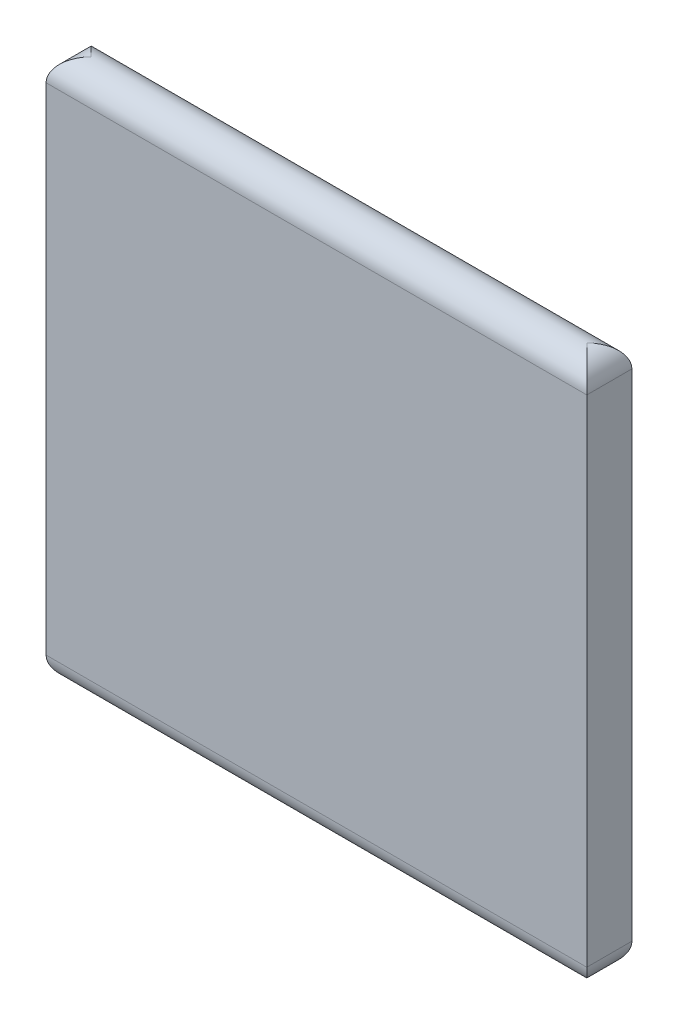
ISO-10303-21;
HEADER;
FILE_DESCRIPTION(('STEP AP214'),'2;1');
FILE_NAME('part.step','',(''),(''),'','','');
FILE_SCHEMA(('AUTOMOTIVE_DESIGN { 1 0 10303 214 1 1 1 1 }'));
ENDSEC;
DATA;
#1=APPLICATION_CONTEXT('core data for automotive mechanical design processes');
#2=APPLICATION_PROTOCOL_DEFINITION('international standard','automotive_design',2000,#1);
#3=PRODUCT_CONTEXT('',#1,'mechanical');
#4=PRODUCT('Part','Part','',(#3));
#5=PRODUCT_RELATED_PRODUCT_CATEGORY('part','',(#4));
#6=PRODUCT_DEFINITION_FORMATION('','',#4);
#7=PRODUCT_DEFINITION_CONTEXT('part definition',#1,'design');
#8=PRODUCT_DEFINITION('design','',#6,#7);
#9=PRODUCT_DEFINITION_SHAPE('','',#8);
#10=(LENGTH_UNIT() NAMED_UNIT(*) SI_UNIT(.MILLI.,.METRE.));
#11=(NAMED_UNIT(*) PLANE_ANGLE_UNIT() SI_UNIT($,.RADIAN.));
#12=(NAMED_UNIT(*) SI_UNIT($,.STERADIAN.) SOLID_ANGLE_UNIT());
#13=UNCERTAINTY_MEASURE_WITH_UNIT(LENGTH_MEASURE(1.E-05),#10,'distance_accuracy_value','');
#14=(GEOMETRIC_REPRESENTATION_CONTEXT(3) GLOBAL_UNCERTAINTY_ASSIGNED_CONTEXT((#13)) GLOBAL_UNIT_ASSIGNED_CONTEXT((#10,
#11,#12)) REPRESENTATION_CONTEXT('',''));
#15=CARTESIAN_POINT('',(0.,0.,0.));
#16=DIRECTION('',(0.,0.,1.));
#17=DIRECTION('',(1.,0.,0.));
#18=AXIS2_PLACEMENT_3D('',#15,#16,#17);
#19=CARTESIAN_POINT('',(0.5,0.5,0.));
#20=DIRECTION('',(0.,0.,1.));
#21=DIRECTION('',(1.,0.,0.));
#22=AXIS2_PLACEMENT_3D('',#19,#20,#21);
#23=CYLINDRICAL_SURFACE('',#22,0.5);
#24=DIRECTION('',(0.,0.,1.));
#25=VECTOR('',#24,1.);
#26=CARTESIAN_POINT('',(0.,0.5,0.));
#27=LINE('',#26,#25);
#28=CARTESIAN_POINT('',(0.,0.5,0.));
#29=VERTEX_POINT('',#28);
#30=CARTESIAN_POINT('',(0.,0.5,1.));
#31=VERTEX_POINT('',#30);
#32=EDGE_CURVE('E102',#29,#31,#27,.T.);
#33=ORIENTED_EDGE('',*,*,#32,.F.);
#34=CARTESIAN_POINT('',(0.5,0.5,0.5));
#35=DIRECTION('',(0.707106781186547,0.,-0.707106781186547));
#36=DIRECTION('',(0.707106781186547,0.,0.707106781186547));
#37=AXIS2_PLACEMENT_3D('',#34,#35,#36);
#38=ELLIPSE('',#37,0.707106781186547,0.5);
#39=CARTESIAN_POINT('',(0.5,0.,0.5));
#40=VERTEX_POINT('',#39);
#41=EDGE_CURVE('E97',#40,#29,#38,.T.);
#42=ORIENTED_EDGE('',*,*,#41,.F.);
#43=CARTESIAN_POINT('',(0.5,0.5,0.5));
#44=DIRECTION('',(0.707106781186547,0.,0.707106781186547));
#45=DIRECTION('',(0.707106781186547,0.,-0.707106781186547));
#46=AXIS2_PLACEMENT_3D('',#43,#44,#45);
#47=ELLIPSE('',#46,0.707106781186547,0.5);
#48=EDGE_CURVE('E95',#31,#40,#47,.T.);
#49=ORIENTED_EDGE('',*,*,#48,.F.);
#50=EDGE_LOOP('',(#33,#42,#49));
#51=FACE_BOUND('',#50,.T.);
#52=ADVANCED_FACE('F17',(#51),#23,.T.);
#53=CARTESIAN_POINT('',(11.5,0.5,0.));
#54=DIRECTION('',(0.,0.,1.));
#55=DIRECTION('',(1.,0.,0.));
#56=AXIS2_PLACEMENT_3D('',#53,#54,#55);
#57=CYLINDRICAL_SURFACE('',#56,0.5);
#58=CARTESIAN_POINT('',(11.5,0.5,0.5));
#59=DIRECTION('',(0.707106781186547,0.,0.707106781186547));
#60=DIRECTION('',(0.707106781186547,0.,-0.707106781186547));
#61=AXIS2_PLACEMENT_3D('',#58,#59,#60);
#62=ELLIPSE('',#61,0.707106781186547,0.5);
#63=CARTESIAN_POINT('',(12.,0.5,0.));
#64=VERTEX_POINT('',#63);
#65=CARTESIAN_POINT('',(11.5,0.,0.5));
#66=VERTEX_POINT('',#65);
#67=EDGE_CURVE('E67',#64,#66,#62,.F.);
#68=ORIENTED_EDGE('',*,*,#67,.F.);
#69=DIRECTION('',(0.,0.,-1.));
#70=VECTOR('',#69,1.);
#71=CARTESIAN_POINT('',(12.,0.5,0.));
#72=LINE('',#71,#70);
#73=CARTESIAN_POINT('',(12.,0.5,1.));
#74=VERTEX_POINT('',#73);
#75=EDGE_CURVE('E77',#74,#64,#72,.T.);
#76=ORIENTED_EDGE('',*,*,#75,.F.);
#77=CARTESIAN_POINT('',(11.5,0.5,0.5));
#78=DIRECTION('',(0.707106781186547,0.,-0.707106781186547));
#79=DIRECTION('',(0.707106781186547,0.,0.707106781186547));
#80=AXIS2_PLACEMENT_3D('',#77,#78,#79);
#81=ELLIPSE('',#80,0.707106781186547,0.5);
#82=EDGE_CURVE('E20',#66,#74,#81,.F.);
#83=ORIENTED_EDGE('',*,*,#82,.F.);
#84=EDGE_LOOP('',(#68,#76,#83));
#85=FACE_BOUND('',#84,.T.);
#86=ADVANCED_FACE('F79',(#85),#57,.T.);
#87=CARTESIAN_POINT('',(0.499999999999999,11.5,0.));
#88=DIRECTION('',(0.,0.,1.));
#89=DIRECTION('',(1.,0.,0.));
#90=AXIS2_PLACEMENT_3D('',#87,#88,#89);
#91=CYLINDRICAL_SURFACE('',#90,0.5);
#92=DIRECTION('',(0.,0.,1.));
#93=VECTOR('',#92,1.);
#94=CARTESIAN_POINT('',(0.,11.5,0.));
#95=LINE('',#94,#93);
#96=CARTESIAN_POINT('',(0.,11.5,1.));
#97=VERTEX_POINT('',#96);
#98=CARTESIAN_POINT('',(0.,11.5,0.));
#99=VERTEX_POINT('',#98);
#100=EDGE_CURVE('E76',#97,#99,#95,.F.);
#101=ORIENTED_EDGE('',*,*,#100,.F.);
#102=CARTESIAN_POINT('',(0.5,11.5,0.5));
#103=DIRECTION('',(0.707106781186547,0.,0.707106781186547));
#104=DIRECTION('',(0.707106781186547,0.,-0.707106781186547));
#105=AXIS2_PLACEMENT_3D('',#102,#103,#104);
#106=ELLIPSE('',#105,0.707106781186547,0.5);
#107=CARTESIAN_POINT('',(0.5,12.,0.5));
#108=VERTEX_POINT('',#107);
#109=EDGE_CURVE('E110',#108,#97,#106,.T.);
#110=ORIENTED_EDGE('',*,*,#109,.F.);
#111=CARTESIAN_POINT('',(0.5,11.5,0.5));
#112=DIRECTION('',(0.707106781186547,0.,-0.707106781186547));
#113=DIRECTION('',(0.707106781186547,0.,0.707106781186547));
#114=AXIS2_PLACEMENT_3D('',#111,#112,#113);
#115=ELLIPSE('',#114,0.707106781186547,0.5);
#116=EDGE_CURVE('E91',#99,#108,#115,.T.);
#117=ORIENTED_EDGE('',*,*,#116,.F.);
#118=EDGE_LOOP('',(#101,#110,#117));
#119=FACE_BOUND('',#118,.T.);
#120=ADVANCED_FACE('F137',(#119),#91,.T.);
#121=CARTESIAN_POINT('',(6.,6.,1.));
#122=DIRECTION('',(0.,0.,1.));
#123=DIRECTION('',(1.,0.,0.));
#124=AXIS2_PLACEMENT_3D('',#121,#122,#123);
#125=PLANE('',#124);
#126=DIRECTION('',(1.,0.,0.));
#127=VECTOR('',#126,1.);
#128=CARTESIAN_POINT('',(-17.3925271309261,0.5,1.));
#129=LINE('',#128,#127);
#130=EDGE_CURVE('E73',#74,#31,#129,.F.);
#131=ORIENTED_EDGE('',*,*,#130,.F.);
#132=DIRECTION('',(0.,1.,0.));
#133=VECTOR('',#132,1.);
#134=CARTESIAN_POINT('',(12.,6.,1.));
#135=LINE('',#134,#133);
#136=CARTESIAN_POINT('',(12.,11.5,1.));
#137=VERTEX_POINT('',#136);
#138=EDGE_CURVE('E86',#137,#74,#135,.F.);
#139=ORIENTED_EDGE('',*,*,#138,.F.);
#140=DIRECTION('',(1.,0.,0.));
#141=VECTOR('',#140,1.);
#142=CARTESIAN_POINT('',(-17.3925271309261,11.5,1.));
#143=LINE('',#142,#141);
#144=EDGE_CURVE('E109',#97,#137,#143,.T.);
#145=ORIENTED_EDGE('',*,*,#144,.F.);
#146=DIRECTION('',(0.,-1.,0.));
#147=VECTOR('',#146,1.);
#148=CARTESIAN_POINT('',(0.,6.,1.));
#149=LINE('',#148,#147);
#150=EDGE_CURVE('E94',#31,#97,#149,.F.);
#151=ORIENTED_EDGE('',*,*,#150,.F.);
#152=EDGE_LOOP('',(#131,#139,#145,#151));
#153=FACE_BOUND('',#152,.T.);
#154=ADVANCED_FACE('F93',(#153),#125,.T.);
#155=CARTESIAN_POINT('',(11.5,11.5,0.));
#156=DIRECTION('',(0.,0.,1.));
#157=DIRECTION('',(1.,0.,0.));
#158=AXIS2_PLACEMENT_3D('',#155,#156,#157);
#159=CYLINDRICAL_SURFACE('',#158,0.5);
#160=CARTESIAN_POINT('',(11.5,11.5,0.5));
#161=DIRECTION('',(0.707106781186547,0.,-0.707106781186547));
#162=DIRECTION('',(0.707106781186547,0.,0.707106781186547));
#163=AXIS2_PLACEMENT_3D('',#160,#161,#162);
#164=ELLIPSE('',#163,0.707106781186547,0.5);
#165=CARTESIAN_POINT('',(11.5,12.,0.5));
#166=VERTEX_POINT('',#165);
#167=EDGE_CURVE('E107',#137,#166,#164,.F.);
#168=ORIENTED_EDGE('',*,*,#167,.F.);
#169=DIRECTION('',(0.,0.,-1.));
#170=VECTOR('',#169,1.);
#171=CARTESIAN_POINT('',(12.,11.5,0.));
#172=LINE('',#171,#170);
#173=CARTESIAN_POINT('',(12.,11.5,0.));
#174=VERTEX_POINT('',#173);
#175=EDGE_CURVE('E83',#174,#137,#172,.F.);
#176=ORIENTED_EDGE('',*,*,#175,.F.);
#177=CARTESIAN_POINT('',(11.5,11.5,0.5));
#178=DIRECTION('',(0.707106781186547,0.,0.707106781186547));
#179=DIRECTION('',(0.707106781186547,0.,-0.707106781186547));
#180=AXIS2_PLACEMENT_3D('',#177,#178,#179);
#181=ELLIPSE('',#180,0.707106781186547,0.5);
#182=EDGE_CURVE('E34',#166,#174,#181,.F.);
#183=ORIENTED_EDGE('',*,*,#182,.F.);
#184=EDGE_LOOP('',(#168,#176,#183));
#185=FACE_BOUND('',#184,.T.);
#186=ADVANCED_FACE('F145',(#185),#159,.T.);
#187=CARTESIAN_POINT('',(0.,6.,0.));
#188=DIRECTION('',(-1.,0.,0.));
#189=DIRECTION('',(0.,-1.,0.));
#190=AXIS2_PLACEMENT_3D('',#187,#188,#189);
#191=PLANE('',#190);
#192=ORIENTED_EDGE('',*,*,#100,.T.);
#193=DIRECTION('',(0.,1.,0.));
#194=VECTOR('',#193,1.);
#195=CARTESIAN_POINT('',(0.,6.,0.));
#196=LINE('',#195,#194);
#197=EDGE_CURVE('E106',#99,#29,#196,.F.);
#198=ORIENTED_EDGE('',*,*,#197,.T.);
#199=ORIENTED_EDGE('',*,*,#32,.T.);
#200=ORIENTED_EDGE('',*,*,#150,.T.);
#201=EDGE_LOOP('',(#192,#198,#199,#200));
#202=FACE_BOUND('',#201,.T.);
#203=ADVANCED_FACE('F127',(#202),#191,.T.);
#204=CARTESIAN_POINT('',(-17.3925271309261,0.5,0.5));
#205=DIRECTION('',(1.,0.,0.));
#206=DIRECTION('',(0.,0.,-1.));
#207=AXIS2_PLACEMENT_3D('',#204,#205,#206);
#208=CYLINDRICAL_SURFACE('',#207,0.5);
#209=DIRECTION('',(1.,0.,0.));
#210=VECTOR('',#209,1.);
#211=CARTESIAN_POINT('',(6.,0.5,0.));
#212=LINE('',#211,#210);
#213=EDGE_CURVE('E100',#29,#64,#212,.T.);
#214=ORIENTED_EDGE('',*,*,#213,.T.);
#215=ORIENTED_EDGE('',*,*,#67,.T.);
#216=ORIENTED_EDGE('',*,*,#82,.T.);
#217=ORIENTED_EDGE('',*,*,#130,.T.);
#218=ORIENTED_EDGE('',*,*,#48,.T.);
#219=ORIENTED_EDGE('',*,*,#41,.T.);
#220=EDGE_LOOP('',(#214,#215,#216,#217,#218,#219));
#221=FACE_BOUND('',#220,.T.);
#222=ADVANCED_FACE('F71',(#221),#208,.T.);
#223=CARTESIAN_POINT('',(12.,6.,0.));
#224=DIRECTION('',(1.,0.,0.));
#225=DIRECTION('',(0.,0.,-1.));
#226=AXIS2_PLACEMENT_3D('',#223,#224,#225);
#227=PLANE('',#226);
#228=ORIENTED_EDGE('',*,*,#175,.T.);
#229=ORIENTED_EDGE('',*,*,#138,.T.);
#230=ORIENTED_EDGE('',*,*,#75,.T.);
#231=DIRECTION('',(0.,1.,0.));
#232=VECTOR('',#231,1.);
#233=CARTESIAN_POINT('',(12.,6.,0.));
#234=LINE('',#233,#232);
#235=EDGE_CURVE('E26',#64,#174,#234,.T.);
#236=ORIENTED_EDGE('',*,*,#235,.T.);
#237=EDGE_LOOP('',(#228,#229,#230,#236));
#238=FACE_BOUND('',#237,.T.);
#239=ADVANCED_FACE('F87',(#238),#227,.T.);
#240=CARTESIAN_POINT('',(-17.3925271309261,11.5,0.5));
#241=DIRECTION('',(1.,0.,0.));
#242=DIRECTION('',(0.,0.,-1.));
#243=AXIS2_PLACEMENT_3D('',#240,#241,#242);
#244=CYLINDRICAL_SURFACE('',#243,0.5);
#245=ORIENTED_EDGE('',*,*,#182,.T.);
#246=DIRECTION('',(1.,0.,0.));
#247=VECTOR('',#246,1.);
#248=CARTESIAN_POINT('',(6.,11.5,0.));
#249=LINE('',#248,#247);
#250=EDGE_CURVE('E11',#174,#99,#249,.F.);
#251=ORIENTED_EDGE('',*,*,#250,.T.);
#252=ORIENTED_EDGE('',*,*,#116,.T.);
#253=ORIENTED_EDGE('',*,*,#109,.T.);
#254=ORIENTED_EDGE('',*,*,#144,.T.);
#255=ORIENTED_EDGE('',*,*,#167,.T.);
#256=EDGE_LOOP('',(#245,#251,#252,#253,#254,#255));
#257=FACE_BOUND('',#256,.T.);
#258=ADVANCED_FACE('F134',(#257),#244,.T.);
#259=CARTESIAN_POINT('',(6.,6.,0.));
#260=DIRECTION('',(0.,0.,1.));
#261=DIRECTION('',(1.,0.,0.));
#262=AXIS2_PLACEMENT_3D('',#259,#260,#261);
#263=PLANE('',#262);
#264=ORIENTED_EDGE('',*,*,#235,.F.);
#265=ORIENTED_EDGE('',*,*,#213,.F.);
#266=ORIENTED_EDGE('',*,*,#197,.F.);
#267=ORIENTED_EDGE('',*,*,#250,.F.);
#268=EDGE_LOOP('',(#264,#265,#266,#267));
#269=FACE_BOUND('',#268,.T.);
#270=ADVANCED_FACE('F124',(#269),#263,.F.);
#271=CLOSED_SHELL('',(#52,#86,#120,#154,#186,#203,#222,#239,#258,#270));
#272=MANIFOLD_SOLID_BREP('B1',#271);
#273=ADVANCED_BREP_SHAPE_REPRESENTATION('',(#18,#272),#14);
#274=SHAPE_DEFINITION_REPRESENTATION(#9,#273);
ENDSEC;
END-ISO-10303-21;
